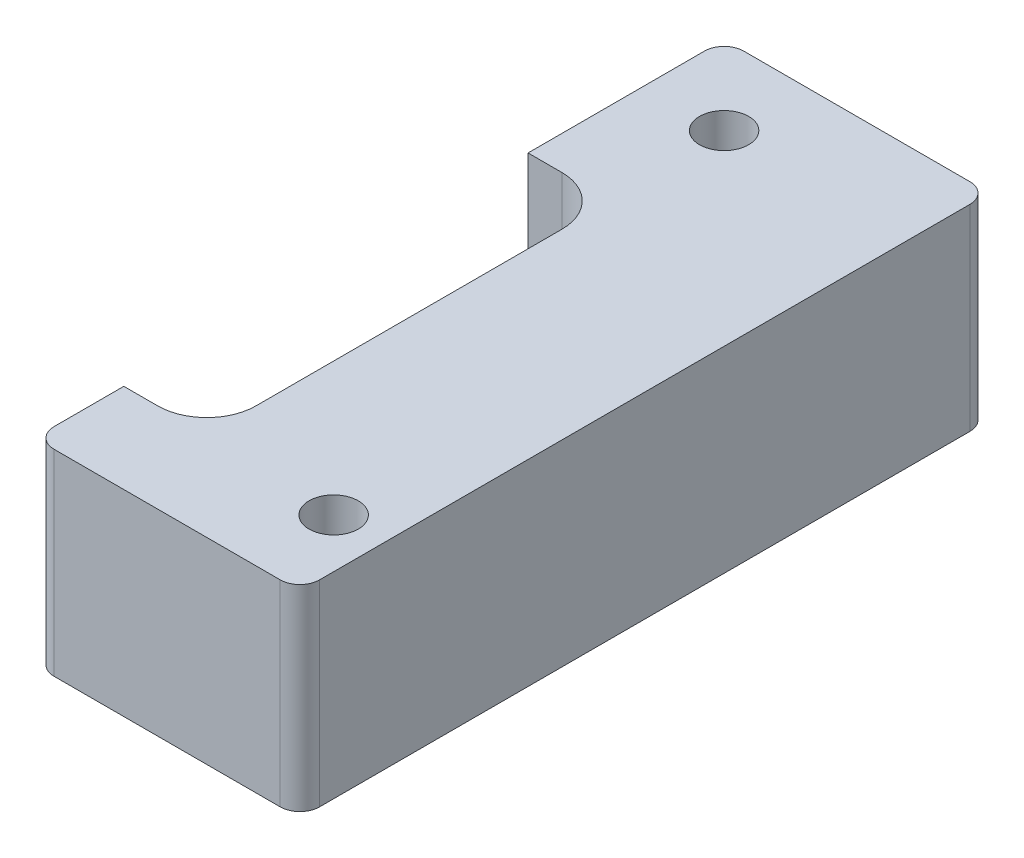
ISO-10303-21;
HEADER;
FILE_DESCRIPTION(('STEP AP214'),'2;1');
FILE_NAME('part.step','',(''),(''),'','','');
FILE_SCHEMA(('AUTOMOTIVE_DESIGN { 1 0 10303 214 1 1 1 1 }'));
ENDSEC;
DATA;
#1=APPLICATION_CONTEXT('core data for automotive mechanical design processes');
#2=APPLICATION_PROTOCOL_DEFINITION('international standard','automotive_design',2000,#1);
#3=PRODUCT_CONTEXT('',#1,'mechanical');
#4=PRODUCT('Part','Part','',(#3));
#5=PRODUCT_RELATED_PRODUCT_CATEGORY('part','',(#4));
#6=PRODUCT_DEFINITION_FORMATION('','',#4);
#7=PRODUCT_DEFINITION_CONTEXT('part definition',#1,'design');
#8=PRODUCT_DEFINITION('design','',#6,#7);
#9=PRODUCT_DEFINITION_SHAPE('','',#8);
#10=(LENGTH_UNIT() NAMED_UNIT(*) SI_UNIT(.MILLI.,.METRE.));
#11=(NAMED_UNIT(*) PLANE_ANGLE_UNIT() SI_UNIT($,.RADIAN.));
#12=(NAMED_UNIT(*) SI_UNIT($,.STERADIAN.) SOLID_ANGLE_UNIT());
#13=UNCERTAINTY_MEASURE_WITH_UNIT(LENGTH_MEASURE(1.E-05),#10,'distance_accuracy_value','');
#14=(GEOMETRIC_REPRESENTATION_CONTEXT(3) GLOBAL_UNCERTAINTY_ASSIGNED_CONTEXT((#13)) GLOBAL_UNIT_ASSIGNED_CONTEXT((#10,
#11,#12)) REPRESENTATION_CONTEXT('',''));
#15=CARTESIAN_POINT('',(0.,0.,0.));
#16=DIRECTION('',(0.,0.,1.));
#17=DIRECTION('',(1.,0.,0.));
#18=AXIS2_PLACEMENT_3D('',#15,#16,#17);
#19=CARTESIAN_POINT('',(5.75000000000002,10.,16.5337182278506));
#20=DIRECTION('',(0.,-1.,0.));
#21=DIRECTION('',(0.,0.,-1.));
#22=AXIS2_PLACEMENT_3D('',#19,#20,#21);
#23=PLANE('',#22);
#24=DIRECTION('',(0.,0.,1.));
#25=VECTOR('',#24,1.);
#26=CARTESIAN_POINT('',(-6.75000000000003,10.,10.4614921127566));
#27=LINE('',#26,#25);
#28=CARTESIAN_POINT('',(-6.75000000000003,10.,12.9874921127072));
#29=VERTEX_POINT('',#28);
#30=CARTESIAN_POINT('',(-6.75000000000003,10.,16.5337182278506));
#31=VERTEX_POINT('',#30);
#32=EDGE_CURVE('E170',#29,#31,#27,.T.);
#33=ORIENTED_EDGE('',*,*,#32,.T.);
#34=CARTESIAN_POINT('',(-5.75000000000003,10.,16.5337182278506));
#35=DIRECTION('',(0.,-1.,0.));
#36=DIRECTION('',(0.,0.,-1.));
#37=AXIS2_PLACEMENT_3D('',#34,#35,#36);
#38=CIRCLE('',#37,1.);
#39=CARTESIAN_POINT('',(-5.75000000000003,10.,17.5337182278506));
#40=VERTEX_POINT('',#39);
#41=EDGE_CURVE('E223',#31,#40,#38,.F.);
#42=ORIENTED_EDGE('',*,*,#41,.T.);
#43=DIRECTION('',(1.,0.,0.));
#44=VECTOR('',#43,1.);
#45=CARTESIAN_POINT('',(-6.75000000000003,10.,17.5337182278506));
#46=LINE('',#45,#44);
#47=CARTESIAN_POINT('',(5.75000000000001,10.,17.5337182278506));
#48=VERTEX_POINT('',#47);
#49=EDGE_CURVE('E172',#40,#48,#46,.T.);
#50=ORIENTED_EDGE('',*,*,#49,.T.);
#51=CARTESIAN_POINT('',(5.75000000000002,10.,16.5337182278506));
#52=DIRECTION('',(0.,1.,0.));
#53=DIRECTION('',(0.,0.,-1.));
#54=AXIS2_PLACEMENT_3D('',#51,#52,#53);
#55=CIRCLE('',#54,1.);
#56=CARTESIAN_POINT('',(6.75000000000002,10.,16.5337182278506));
#57=VERTEX_POINT('',#56);
#58=EDGE_CURVE('E198',#48,#57,#55,.T.);
#59=ORIENTED_EDGE('',*,*,#58,.T.);
#60=DIRECTION('',(0.,0.,-1.));
#61=VECTOR('',#60,1.);
#62=CARTESIAN_POINT('',(6.75000000000002,10.,-16.5385078872438));
#63=LINE('',#62,#61);
#64=CARTESIAN_POINT('',(6.75000000000002,10.,-16.5385078872438));
#65=VERTEX_POINT('',#64);
#66=EDGE_CURVE('E273',#57,#65,#63,.T.);
#67=ORIENTED_EDGE('',*,*,#66,.T.);
#68=CARTESIAN_POINT('',(5.75000000000002,10.,-16.5385078872439));
#69=DIRECTION('',(0.,1.,0.));
#70=DIRECTION('',(0.,0.,-1.));
#71=AXIS2_PLACEMENT_3D('',#68,#69,#70);
#72=CIRCLE('',#71,1.);
#73=CARTESIAN_POINT('',(5.75000000000001,10.,-17.5385078872439));
#74=VERTEX_POINT('',#73);
#75=EDGE_CURVE('E275',#65,#74,#72,.T.);
#76=ORIENTED_EDGE('',*,*,#75,.T.);
#77=DIRECTION('',(-1.,0.,0.));
#78=VECTOR('',#77,1.);
#79=CARTESIAN_POINT('',(-5.75000000000002,10.,-17.5385078872439));
#80=LINE('',#79,#78);
#81=CARTESIAN_POINT('',(-5.75000000000002,10.,-17.5385078872439));
#82=VERTEX_POINT('',#81);
#83=EDGE_CURVE('E174',#74,#82,#80,.T.);
#84=ORIENTED_EDGE('',*,*,#83,.T.);
#85=CARTESIAN_POINT('',(-5.75000000000003,10.,-16.5385078872439));
#86=DIRECTION('',(0.,1.,0.));
#87=DIRECTION('',(0.,0.,-1.));
#88=AXIS2_PLACEMENT_3D('',#85,#86,#87);
#89=CIRCLE('',#88,1.);
#90=CARTESIAN_POINT('',(-6.75000000000003,10.,-16.5385078872438));
#91=VERTEX_POINT('',#90);
#92=EDGE_CURVE('E168',#82,#91,#89,.T.);
#93=ORIENTED_EDGE('',*,*,#92,.T.);
#94=DIRECTION('',(0.,0.,1.));
#95=VECTOR('',#94,1.);
#96=CARTESIAN_POINT('',(-6.75000000000003,10.,-16.5385078872438));
#97=LINE('',#96,#95);
#98=CARTESIAN_POINT('',(-6.75000000000003,10.,-7.56850788728844));
#99=VERTEX_POINT('',#98);
#100=EDGE_CURVE('E159',#91,#99,#97,.T.);
#101=ORIENTED_EDGE('',*,*,#100,.T.);
#102=DIRECTION('',(-1.,0.,0.));
#103=VECTOR('',#102,1.);
#104=CARTESIAN_POINT('',(-7.75000000008768,10.,-7.56850788728844));
#105=LINE('',#104,#103);
#106=CARTESIAN_POINT('',(-5.02868410830065,10.,-7.56850788728844));
#107=VERTEX_POINT('',#106);
#108=EDGE_CURVE('E141',#107,#99,#105,.T.);
#109=ORIENTED_EDGE('',*,*,#108,.F.);
#110=CARTESIAN_POINT('',(-5.02868410830065,10.,-5.06850788728844));
#111=DIRECTION('',(0.,-1.,0.));
#112=DIRECTION('',(0.,0.,-1.));
#113=AXIS2_PLACEMENT_3D('',#110,#111,#112);
#114=CIRCLE('',#113,2.5);
#115=CARTESIAN_POINT('',(-2.52868410830065,10.,-5.06850788728844));
#116=VERTEX_POINT('',#115);
#117=EDGE_CURVE('E235',#107,#116,#114,.T.);
#118=ORIENTED_EDGE('',*,*,#117,.T.);
#119=DIRECTION('',(0.,0.,-1.));
#120=VECTOR('',#119,1.);
#121=CARTESIAN_POINT('',(-2.52868410830065,10.,12.9874921127072));
#122=LINE('',#121,#120);
#123=CARTESIAN_POINT('',(-2.52868410830065,10.,10.4874921127072));
#124=VERTEX_POINT('',#123);
#125=EDGE_CURVE('E151',#124,#116,#122,.T.);
#126=ORIENTED_EDGE('',*,*,#125,.F.);
#127=CARTESIAN_POINT('',(-5.02868410830065,10.,10.4874921127072));
#128=DIRECTION('',(0.,-1.,0.));
#129=DIRECTION('',(0.,0.,-1.));
#130=AXIS2_PLACEMENT_3D('',#127,#128,#129);
#131=CIRCLE('',#130,2.5);
#132=CARTESIAN_POINT('',(-5.02868410830065,10.,12.9874921127072));
#133=VERTEX_POINT('',#132);
#134=EDGE_CURVE('E11',#124,#133,#131,.T.);
#135=ORIENTED_EDGE('',*,*,#134,.T.);
#136=DIRECTION('',(1.,0.,0.));
#137=VECTOR('',#136,1.);
#138=CARTESIAN_POINT('',(-7.75000000008768,10.,12.9874921127072));
#139=LINE('',#138,#137);
#140=EDGE_CURVE('E253',#29,#133,#139,.T.);
#141=ORIENTED_EDGE('',*,*,#140,.F.);
#142=EDGE_LOOP('',(#33,#42,#50,#59,#67,#76,#84,#93,#101,#109,#118,#126,#135,#141));
#143=FACE_BOUND('',#142,.T.);
#144=CARTESIAN_POINT('',(-2.75000000000003,10.,-13.5385078872439));
#145=DIRECTION('',(0.,1.,0.));
#146=DIRECTION('',(0.,0.,1.));
#147=AXIS2_PLACEMENT_3D('',#144,#145,#146);
#148=CIRCLE('',#147,1.25);
#149=CARTESIAN_POINT('',(-2.75000000000003,10.,-12.2885078872439));
#150=VERTEX_POINT('',#149);
#151=EDGE_CURVE('E184',#150,#150,#148,.T.);
#152=ORIENTED_EDGE('',*,*,#151,.F.);
#153=EDGE_LOOP('',(#152));
#154=FACE_BOUND('',#153,.T.);
#155=CARTESIAN_POINT('',(4.25000000000003,10.,13.3168200507594));
#156=DIRECTION('',(0.,1.,0.));
#157=DIRECTION('',(0.,0.,1.));
#158=AXIS2_PLACEMENT_3D('',#155,#156,#157);
#159=CIRCLE('',#158,1.25);
#160=CARTESIAN_POINT('',(4.25000000000003,10.,14.5668200507594));
#161=VERTEX_POINT('',#160);
#162=EDGE_CURVE('E258',#161,#161,#159,.T.);
#163=ORIENTED_EDGE('',*,*,#162,.F.);
#164=EDGE_LOOP('',(#163));
#165=FACE_BOUND('',#164,.T.);
#166=ADVANCED_FACE('F41',(#143,#154,#165),#23,.F.);
#167=CARTESIAN_POINT('',(5.75000000000002,0.,16.5337182278506));
#168=DIRECTION('',(0.,-1.,0.));
#169=DIRECTION('',(0.,0.,-1.));
#170=AXIS2_PLACEMENT_3D('',#167,#168,#169);
#171=PLANE('',#170);
#172=DIRECTION('',(1.,0.,0.));
#173=VECTOR('',#172,1.);
#174=CARTESIAN_POINT('',(1.25000000000056,0.,17.5337182278506));
#175=LINE('',#174,#173);
#176=CARTESIAN_POINT('',(-5.75000000000003,0.,17.5337182278506));
#177=VERTEX_POINT('',#176);
#178=CARTESIAN_POINT('',(5.75000000000001,0.,17.5337182278506));
#179=VERTEX_POINT('',#178);
#180=EDGE_CURVE('E196',#177,#179,#175,.T.);
#181=ORIENTED_EDGE('',*,*,#180,.F.);
#182=CARTESIAN_POINT('',(-5.75000000000003,0.,16.5337182278506));
#183=DIRECTION('',(0.,-1.,0.));
#184=DIRECTION('',(0.,0.,-1.));
#185=AXIS2_PLACEMENT_3D('',#182,#183,#184);
#186=CIRCLE('',#185,1.);
#187=CARTESIAN_POINT('',(-6.75000000000003,0.,16.5337182278506));
#188=VERTEX_POINT('',#187);
#189=EDGE_CURVE('E219',#177,#188,#186,.T.);
#190=ORIENTED_EDGE('',*,*,#189,.T.);
#191=DIRECTION('',(0.,0.,1.));
#192=VECTOR('',#191,1.);
#193=CARTESIAN_POINT('',(-6.75000000000003,0.,16.5337182278506));
#194=LINE('',#193,#192);
#195=CARTESIAN_POINT('',(-6.75000000000003,0.,12.9874921127072));
#196=VERTEX_POINT('',#195);
#197=EDGE_CURVE('E193',#196,#188,#194,.T.);
#198=ORIENTED_EDGE('',*,*,#197,.F.);
#199=DIRECTION('',(-1.,0.,0.));
#200=VECTOR('',#199,1.);
#201=CARTESIAN_POINT('',(-7.75000000008768,0.,12.9874921127072));
#202=LINE('',#201,#200);
#203=CARTESIAN_POINT('',(-5.02868410830065,0.,12.9874921127072));
#204=VERTEX_POINT('',#203);
#205=EDGE_CURVE('E245',#204,#196,#202,.T.);
#206=ORIENTED_EDGE('',*,*,#205,.F.);
#207=CARTESIAN_POINT('',(-5.02868410830065,0.,10.4874921127072));
#208=DIRECTION('',(0.,-1.,0.));
#209=DIRECTION('',(0.,0.,-1.));
#210=AXIS2_PLACEMENT_3D('',#207,#208,#209);
#211=CIRCLE('',#210,2.5);
#212=CARTESIAN_POINT('',(-2.52868410830065,0.,10.4874921127072));
#213=VERTEX_POINT('',#212);
#214=EDGE_CURVE('E49',#204,#213,#211,.F.);
#215=ORIENTED_EDGE('',*,*,#214,.T.);
#216=DIRECTION('',(0.,0.,1.));
#217=VECTOR('',#216,1.);
#218=CARTESIAN_POINT('',(-2.52868410830065,0.,12.9874921127072));
#219=LINE('',#218,#217);
#220=CARTESIAN_POINT('',(-2.52868410830065,0.,-5.06850788728844));
#221=VERTEX_POINT('',#220);
#222=EDGE_CURVE('E243',#221,#213,#219,.T.);
#223=ORIENTED_EDGE('',*,*,#222,.F.);
#224=CARTESIAN_POINT('',(-5.02868410830065,0.,-5.06850788728844));
#225=DIRECTION('',(0.,-1.,0.));
#226=DIRECTION('',(0.,0.,-1.));
#227=AXIS2_PLACEMENT_3D('',#224,#225,#226);
#228=CIRCLE('',#227,2.5);
#229=CARTESIAN_POINT('',(-5.02868410830065,0.,-7.56850788728844));
#230=VERTEX_POINT('',#229);
#231=EDGE_CURVE('E233',#221,#230,#228,.F.);
#232=ORIENTED_EDGE('',*,*,#231,.T.);
#233=DIRECTION('',(1.,0.,0.));
#234=VECTOR('',#233,1.);
#235=CARTESIAN_POINT('',(-7.75000000008768,0.,-7.56850788728844));
#236=LINE('',#235,#234);
#237=CARTESIAN_POINT('',(-6.75000000000003,0.,-7.56850788728844));
#238=VERTEX_POINT('',#237);
#239=EDGE_CURVE('E152',#238,#230,#236,.T.);
#240=ORIENTED_EDGE('',*,*,#239,.F.);
#241=DIRECTION('',(0.,0.,1.));
#242=VECTOR('',#241,1.);
#243=CARTESIAN_POINT('',(-6.75000000000003,0.,-16.5385078872438));
#244=LINE('',#243,#242);
#245=CARTESIAN_POINT('',(-6.75000000000003,0.,-16.5385078872438));
#246=VERTEX_POINT('',#245);
#247=EDGE_CURVE('E161',#246,#238,#244,.T.);
#248=ORIENTED_EDGE('',*,*,#247,.F.);
#249=CARTESIAN_POINT('',(-5.75000000000003,0.,-16.5385078872439));
#250=DIRECTION('',(0.,1.,0.));
#251=DIRECTION('',(0.,0.,-1.));
#252=AXIS2_PLACEMENT_3D('',#249,#250,#251);
#253=CIRCLE('',#252,1.);
#254=CARTESIAN_POINT('',(-5.75000000000002,0.,-17.5385078872439));
#255=VERTEX_POINT('',#254);
#256=EDGE_CURVE('E190',#255,#246,#253,.T.);
#257=ORIENTED_EDGE('',*,*,#256,.F.);
#258=DIRECTION('',(-1.,0.,0.));
#259=VECTOR('',#258,1.);
#260=CARTESIAN_POINT('',(-5.75000000000002,0.,-17.5385078872439));
#261=LINE('',#260,#259);
#262=CARTESIAN_POINT('',(5.75000000000001,0.,-17.5385078872439));
#263=VERTEX_POINT('',#262);
#264=EDGE_CURVE('E188',#263,#255,#261,.T.);
#265=ORIENTED_EDGE('',*,*,#264,.F.);
#266=CARTESIAN_POINT('',(5.75000000000002,0.,-16.5385078872439));
#267=DIRECTION('',(0.,1.,0.));
#268=DIRECTION('',(0.,0.,-1.));
#269=AXIS2_PLACEMENT_3D('',#266,#267,#268);
#270=CIRCLE('',#269,1.);
#271=CARTESIAN_POINT('',(6.75000000000002,0.,-16.5385078872438));
#272=VERTEX_POINT('',#271);
#273=EDGE_CURVE('E186',#272,#263,#270,.T.);
#274=ORIENTED_EDGE('',*,*,#273,.F.);
#275=DIRECTION('',(0.,0.,-1.));
#276=VECTOR('',#275,1.);
#277=CARTESIAN_POINT('',(6.75000000000002,0.,-16.5385078872438));
#278=LINE('',#277,#276);
#279=CARTESIAN_POINT('',(6.75000000000002,0.,16.5337182278506));
#280=VERTEX_POINT('',#279);
#281=EDGE_CURVE('E183',#280,#272,#278,.T.);
#282=ORIENTED_EDGE('',*,*,#281,.F.);
#283=CARTESIAN_POINT('',(5.75000000000002,0.,16.5337182278506));
#284=DIRECTION('',(0.,1.,0.));
#285=DIRECTION('',(0.,0.,-1.));
#286=AXIS2_PLACEMENT_3D('',#283,#284,#285);
#287=CIRCLE('',#286,1.);
#288=EDGE_CURVE('E180',#179,#280,#287,.T.);
#289=ORIENTED_EDGE('',*,*,#288,.F.);
#290=EDGE_LOOP('',(#181,#190,#198,#206,#215,#223,#232,#240,#248,#257,#265,#274,#282,#289));
#291=FACE_BOUND('',#290,.T.);
#292=CARTESIAN_POINT('',(-2.75000000000003,0.,-13.5385078872439));
#293=DIRECTION('',(0.,1.,0.));
#294=DIRECTION('',(0.,0.,1.));
#295=AXIS2_PLACEMENT_3D('',#292,#293,#294);
#296=CIRCLE('',#295,1.25);
#297=CARTESIAN_POINT('',(-2.75000000000003,0.,-12.2885078872439));
#298=VERTEX_POINT('',#297);
#299=EDGE_CURVE('E265',#298,#298,#296,.T.);
#300=ORIENTED_EDGE('',*,*,#299,.T.);
#301=EDGE_LOOP('',(#300));
#302=FACE_BOUND('',#301,.T.);
#303=CARTESIAN_POINT('',(4.25000000000003,0.,13.3168200507594));
#304=DIRECTION('',(0.,1.,0.));
#305=DIRECTION('',(0.,0.,1.));
#306=AXIS2_PLACEMENT_3D('',#303,#304,#305);
#307=CIRCLE('',#306,1.25);
#308=CARTESIAN_POINT('',(4.25000000000003,0.,14.5668200507594));
#309=VERTEX_POINT('',#308);
#310=EDGE_CURVE('E255',#309,#309,#307,.T.);
#311=ORIENTED_EDGE('',*,*,#310,.T.);
#312=EDGE_LOOP('',(#311));
#313=FACE_BOUND('',#312,.T.);
#314=ADVANCED_FACE('F241',(#291,#302,#313),#171,.T.);
#315=CARTESIAN_POINT('',(5.75000000000002,10.,16.5337182278506));
#316=DIRECTION('',(0.,-1.,0.));
#317=DIRECTION('',(0.,0.,-1.));
#318=AXIS2_PLACEMENT_3D('',#315,#316,#317);
#319=CYLINDRICAL_SURFACE('',#318,1.);
#320=ORIENTED_EDGE('',*,*,#288,.T.);
#321=DIRECTION('',(0.,-1.,0.));
#322=VECTOR('',#321,1.);
#323=CARTESIAN_POINT('',(6.75000000000002,10.,16.5337182278506));
#324=LINE('',#323,#322);
#325=EDGE_CURVE('E212',#57,#280,#324,.T.);
#326=ORIENTED_EDGE('',*,*,#325,.F.);
#327=ORIENTED_EDGE('',*,*,#58,.F.);
#328=DIRECTION('',(0.,-1.,0.));
#329=VECTOR('',#328,1.);
#330=CARTESIAN_POINT('',(5.75000000000001,10.,17.5337182278506));
#331=LINE('',#330,#329);
#332=EDGE_CURVE('E179',#48,#179,#331,.T.);
#333=ORIENTED_EDGE('',*,*,#332,.T.);
#334=EDGE_LOOP('',(#320,#326,#327,#333));
#335=FACE_BOUND('',#334,.T.);
#336=ADVANCED_FACE('F302',(#335),#319,.T.);
#337=CARTESIAN_POINT('',(6.75000000000002,10.,-16.5385078872438));
#338=DIRECTION('',(-1.,0.,0.));
#339=DIRECTION('',(0.,0.,1.));
#340=AXIS2_PLACEMENT_3D('',#337,#338,#339);
#341=PLANE('',#340);
#342=ORIENTED_EDGE('',*,*,#281,.T.);
#343=DIRECTION('',(0.,-1.,0.));
#344=VECTOR('',#343,1.);
#345=CARTESIAN_POINT('',(6.75000000000002,10.,-16.5385078872438));
#346=LINE('',#345,#344);
#347=EDGE_CURVE('E209',#65,#272,#346,.T.);
#348=ORIENTED_EDGE('',*,*,#347,.F.);
#349=ORIENTED_EDGE('',*,*,#66,.F.);
#350=ORIENTED_EDGE('',*,*,#325,.T.);
#351=EDGE_LOOP('',(#342,#348,#349,#350));
#352=FACE_BOUND('',#351,.T.);
#353=ADVANCED_FACE('F325',(#352),#341,.F.);
#354=CARTESIAN_POINT('',(5.75000000000002,10.,-16.5385078872439));
#355=DIRECTION('',(0.,-1.,0.));
#356=DIRECTION('',(0.,0.,-1.));
#357=AXIS2_PLACEMENT_3D('',#354,#355,#356);
#358=CYLINDRICAL_SURFACE('',#357,1.);
#359=ORIENTED_EDGE('',*,*,#273,.T.);
#360=DIRECTION('',(0.,-1.,0.));
#361=VECTOR('',#360,1.);
#362=CARTESIAN_POINT('',(5.75000000000001,10.,-17.5385078872439));
#363=LINE('',#362,#361);
#364=EDGE_CURVE('E206',#74,#263,#363,.T.);
#365=ORIENTED_EDGE('',*,*,#364,.F.);
#366=ORIENTED_EDGE('',*,*,#75,.F.);
#367=ORIENTED_EDGE('',*,*,#347,.T.);
#368=EDGE_LOOP('',(#359,#365,#366,#367));
#369=FACE_BOUND('',#368,.T.);
#370=ADVANCED_FACE('F322',(#369),#358,.T.);
#371=CARTESIAN_POINT('',(-5.75000000000002,10.,-17.5385078872439));
#372=DIRECTION('',(0.,0.,1.));
#373=DIRECTION('',(1.,0.,0.));
#374=AXIS2_PLACEMENT_3D('',#371,#372,#373);
#375=PLANE('',#374);
#376=ORIENTED_EDGE('',*,*,#264,.T.);
#377=DIRECTION('',(0.,-1.,0.));
#378=VECTOR('',#377,1.);
#379=CARTESIAN_POINT('',(-5.75000000000002,10.,-17.5385078872439));
#380=LINE('',#379,#378);
#381=EDGE_CURVE('E203',#82,#255,#380,.T.);
#382=ORIENTED_EDGE('',*,*,#381,.F.);
#383=ORIENTED_EDGE('',*,*,#83,.F.);
#384=ORIENTED_EDGE('',*,*,#364,.T.);
#385=EDGE_LOOP('',(#376,#382,#383,#384));
#386=FACE_BOUND('',#385,.T.);
#387=ADVANCED_FACE('F281',(#386),#375,.F.);
#388=CARTESIAN_POINT('',(-5.75000000000003,10.,-16.5385078872439));
#389=DIRECTION('',(0.,-1.,0.));
#390=DIRECTION('',(0.,0.,-1.));
#391=AXIS2_PLACEMENT_3D('',#388,#389,#390);
#392=CYLINDRICAL_SURFACE('',#391,1.);
#393=ORIENTED_EDGE('',*,*,#256,.T.);
#394=DIRECTION('',(0.,-1.,0.));
#395=VECTOR('',#394,1.);
#396=CARTESIAN_POINT('',(-6.75000000000003,10.,-16.5385078872438));
#397=LINE('',#396,#395);
#398=EDGE_CURVE('E201',#91,#246,#397,.T.);
#399=ORIENTED_EDGE('',*,*,#398,.F.);
#400=ORIENTED_EDGE('',*,*,#92,.F.);
#401=ORIENTED_EDGE('',*,*,#381,.T.);
#402=EDGE_LOOP('',(#393,#399,#400,#401));
#403=FACE_BOUND('',#402,.T.);
#404=ADVANCED_FACE('F285',(#403),#392,.T.);
#405=CARTESIAN_POINT('',(-6.75000000000003,10.,-16.5385078872438));
#406=DIRECTION('',(1.,0.,0.));
#407=DIRECTION('',(0.,0.,-1.));
#408=AXIS2_PLACEMENT_3D('',#405,#406,#407);
#409=PLANE('',#408);
#410=ORIENTED_EDGE('',*,*,#247,.T.);
#411=DIRECTION('',(0.,1.,0.));
#412=VECTOR('',#411,1.);
#413=CARTESIAN_POINT('',(-6.75000000000003,10.,-7.56850788728844));
#414=LINE('',#413,#412);
#415=EDGE_CURVE('E145',#238,#99,#414,.T.);
#416=ORIENTED_EDGE('',*,*,#415,.T.);
#417=ORIENTED_EDGE('',*,*,#100,.F.);
#418=ORIENTED_EDGE('',*,*,#398,.T.);
#419=EDGE_LOOP('',(#410,#416,#417,#418));
#420=FACE_BOUND('',#419,.T.);
#421=ADVANCED_FACE('F157',(#420),#409,.F.);
#422=CARTESIAN_POINT('',(-6.75000000000003,10.,16.5337182278506));
#423=DIRECTION('',(1.,0.,0.));
#424=DIRECTION('',(0.,0.,-1.));
#425=AXIS2_PLACEMENT_3D('',#422,#423,#424);
#426=PLANE('',#425);
#427=ORIENTED_EDGE('',*,*,#197,.T.);
#428=DIRECTION('',(0.,-1.,0.));
#429=VECTOR('',#428,1.);
#430=CARTESIAN_POINT('',(-6.75000000000003,10.,16.5337182278506));
#431=LINE('',#430,#429);
#432=EDGE_CURVE('E221',#188,#31,#431,.F.);
#433=ORIENTED_EDGE('',*,*,#432,.T.);
#434=ORIENTED_EDGE('',*,*,#32,.F.);
#435=DIRECTION('',(0.,-1.,0.));
#436=VECTOR('',#435,1.);
#437=CARTESIAN_POINT('',(-6.75000000000003,10.,12.9874921127072));
#438=LINE('',#437,#436);
#439=EDGE_CURVE('E163',#29,#196,#438,.T.);
#440=ORIENTED_EDGE('',*,*,#439,.T.);
#441=EDGE_LOOP('',(#427,#433,#434,#440));
#442=FACE_BOUND('',#441,.T.);
#443=ADVANCED_FACE('F311',(#442),#426,.F.);
#444=CARTESIAN_POINT('',(1.25000000000056,10.,17.5337182278506));
#445=DIRECTION('',(0.,0.,-1.));
#446=DIRECTION('',(-1.,0.,0.));
#447=AXIS2_PLACEMENT_3D('',#444,#445,#446);
#448=PLANE('',#447);
#449=ORIENTED_EDGE('',*,*,#49,.F.);
#450=DIRECTION('',(0.,-1.,0.));
#451=VECTOR('',#450,1.);
#452=CARTESIAN_POINT('',(-5.75000000000003,10.,17.5337182278506));
#453=LINE('',#452,#451);
#454=EDGE_CURVE('E162',#40,#177,#453,.T.);
#455=ORIENTED_EDGE('',*,*,#454,.T.);
#456=ORIENTED_EDGE('',*,*,#180,.T.);
#457=ORIENTED_EDGE('',*,*,#332,.F.);
#458=EDGE_LOOP('',(#449,#455,#456,#457));
#459=FACE_BOUND('',#458,.T.);
#460=ADVANCED_FACE('F308',(#459),#448,.F.);
#461=CARTESIAN_POINT('',(-2.75000000000003,10.,-13.5385078872439));
#462=DIRECTION('',(0.,-1.,0.));
#463=DIRECTION('',(0.,0.,-1.));
#464=AXIS2_PLACEMENT_3D('',#461,#462,#463);
#465=CYLINDRICAL_SURFACE('',#464,1.25);
#466=ORIENTED_EDGE('',*,*,#151,.T.);
#467=EDGE_LOOP('',(#466));
#468=FACE_BOUND('',#467,.T.);
#469=ORIENTED_EDGE('',*,*,#299,.F.);
#470=EDGE_LOOP('',(#469));
#471=FACE_BOUND('',#470,.T.);
#472=ADVANCED_FACE('F305',(#468,#471),#465,.F.);
#473=CARTESIAN_POINT('',(4.25000000000003,10.,13.3168200507594));
#474=DIRECTION('',(0.,-1.,0.));
#475=DIRECTION('',(0.,0.,-1.));
#476=AXIS2_PLACEMENT_3D('',#473,#474,#475);
#477=CYLINDRICAL_SURFACE('',#476,1.25);
#478=ORIENTED_EDGE('',*,*,#162,.T.);
#479=EDGE_LOOP('',(#478));
#480=FACE_BOUND('',#479,.T.);
#481=ORIENTED_EDGE('',*,*,#310,.F.);
#482=EDGE_LOOP('',(#481));
#483=FACE_BOUND('',#482,.T.);
#484=ADVANCED_FACE('F373',(#480,#483),#477,.F.);
#485=CARTESIAN_POINT('',(-7.75000000008768,31.2087546933253,-7.56850788728844));
#486=DIRECTION('',(0.,0.,-1.));
#487=DIRECTION('',(-1.,0.,0.));
#488=AXIS2_PLACEMENT_3D('',#485,#486,#487);
#489=PLANE('',#488);
#490=ORIENTED_EDGE('',*,*,#239,.T.);
#491=DIRECTION('',(0.,-1.,0.));
#492=VECTOR('',#491,1.);
#493=CARTESIAN_POINT('',(-5.02868410830065,10.,-7.56850788728844));
#494=LINE('',#493,#492);
#495=EDGE_CURVE('E148',#230,#107,#494,.F.);
#496=ORIENTED_EDGE('',*,*,#495,.T.);
#497=ORIENTED_EDGE('',*,*,#108,.T.);
#498=ORIENTED_EDGE('',*,*,#415,.F.);
#499=EDGE_LOOP('',(#490,#496,#497,#498));
#500=FACE_BOUND('',#499,.T.);
#501=ADVANCED_FACE('F144',(#500),#489,.F.);
#502=CARTESIAN_POINT('',(-7.75000000008768,31.2087546933253,12.9874921127072));
#503=DIRECTION('',(0.,0.,1.));
#504=DIRECTION('',(1.,0.,0.));
#505=AXIS2_PLACEMENT_3D('',#502,#503,#504);
#506=PLANE('',#505);
#507=ORIENTED_EDGE('',*,*,#140,.T.);
#508=DIRECTION('',(0.,-1.,0.));
#509=VECTOR('',#508,1.);
#510=CARTESIAN_POINT('',(-5.02868410830065,0.,12.9874921127072));
#511=LINE('',#510,#509);
#512=EDGE_CURVE('E231',#133,#204,#511,.T.);
#513=ORIENTED_EDGE('',*,*,#512,.T.);
#514=ORIENTED_EDGE('',*,*,#205,.T.);
#515=ORIENTED_EDGE('',*,*,#439,.F.);
#516=EDGE_LOOP('',(#507,#513,#514,#515));
#517=FACE_BOUND('',#516,.T.);
#518=ADVANCED_FACE('F252',(#517),#506,.F.);
#519=CARTESIAN_POINT('',(-2.52868410830065,31.2087546933253,12.9874921127072));
#520=DIRECTION('',(1.,0.,0.));
#521=DIRECTION('',(0.,0.,-1.));
#522=AXIS2_PLACEMENT_3D('',#519,#520,#521);
#523=PLANE('',#522);
#524=ORIENTED_EDGE('',*,*,#125,.T.);
#525=DIRECTION('',(0.,-1.,0.));
#526=VECTOR('',#525,1.);
#527=CARTESIAN_POINT('',(-2.52868410830065,0.,-5.06850788728844));
#528=LINE('',#527,#526);
#529=EDGE_CURVE('E227',#116,#221,#528,.T.);
#530=ORIENTED_EDGE('',*,*,#529,.T.);
#531=ORIENTED_EDGE('',*,*,#222,.T.);
#532=DIRECTION('',(0.,-1.,0.));
#533=VECTOR('',#532,1.);
#534=CARTESIAN_POINT('',(-2.52868410830065,10.,10.4874921127072));
#535=LINE('',#534,#533);
#536=EDGE_CURVE('E225',#213,#124,#535,.F.);
#537=ORIENTED_EDGE('',*,*,#536,.T.);
#538=EDGE_LOOP('',(#524,#530,#531,#537));
#539=FACE_BOUND('',#538,.T.);
#540=ADVANCED_FACE('F248',(#539),#523,.F.);
#541=CARTESIAN_POINT('',(-5.75000000000003,10.,16.5337182278506));
#542=DIRECTION('',(0.,-1.,0.));
#543=DIRECTION('',(0.,0.,-1.));
#544=AXIS2_PLACEMENT_3D('',#541,#542,#543);
#545=CYLINDRICAL_SURFACE('',#544,1.);
#546=ORIENTED_EDGE('',*,*,#41,.F.);
#547=ORIENTED_EDGE('',*,*,#432,.F.);
#548=ORIENTED_EDGE('',*,*,#189,.F.);
#549=ORIENTED_EDGE('',*,*,#454,.F.);
#550=EDGE_LOOP('',(#546,#547,#548,#549));
#551=FACE_BOUND('',#550,.T.);
#552=ADVANCED_FACE('F289',(#551),#545,.T.);
#553=CARTESIAN_POINT('',(-5.02868410830065,31.2087546933253,-5.06850788728844));
#554=DIRECTION('',(0.,1.,0.));
#555=DIRECTION('',(0.,0.,1.));
#556=AXIS2_PLACEMENT_3D('',#553,#554,#555);
#557=CYLINDRICAL_SURFACE('',#556,2.5);
#558=ORIENTED_EDGE('',*,*,#117,.F.);
#559=ORIENTED_EDGE('',*,*,#495,.F.);
#560=ORIENTED_EDGE('',*,*,#231,.F.);
#561=ORIENTED_EDGE('',*,*,#529,.F.);
#562=EDGE_LOOP('',(#558,#559,#560,#561));
#563=FACE_BOUND('',#562,.T.);
#564=ADVANCED_FACE('F287',(#563),#557,.F.);
#565=CARTESIAN_POINT('',(-5.02868410830065,31.2087546933253,10.4874921127072));
#566=DIRECTION('',(0.,1.,0.));
#567=DIRECTION('',(0.,0.,1.));
#568=AXIS2_PLACEMENT_3D('',#565,#566,#567);
#569=CYLINDRICAL_SURFACE('',#568,2.5);
#570=ORIENTED_EDGE('',*,*,#134,.F.);
#571=ORIENTED_EDGE('',*,*,#536,.F.);
#572=ORIENTED_EDGE('',*,*,#214,.F.);
#573=ORIENTED_EDGE('',*,*,#512,.F.);
#574=EDGE_LOOP('',(#570,#571,#572,#573));
#575=FACE_BOUND('',#574,.T.);
#576=ADVANCED_FACE('F43',(#575),#569,.F.);
#577=CLOSED_SHELL('',(#166,#314,#336,#353,#370,#387,#404,#421,#443,#460,#472,#484,#501,#518,
#540,#552,#564,#576));
#578=MANIFOLD_SOLID_BREP('B2',#577);
#579=ADVANCED_BREP_SHAPE_REPRESENTATION('',(#18,#578),#14);
#580=SHAPE_DEFINITION_REPRESENTATION(#9,#579);
ENDSEC;
END-ISO-10303-21;
